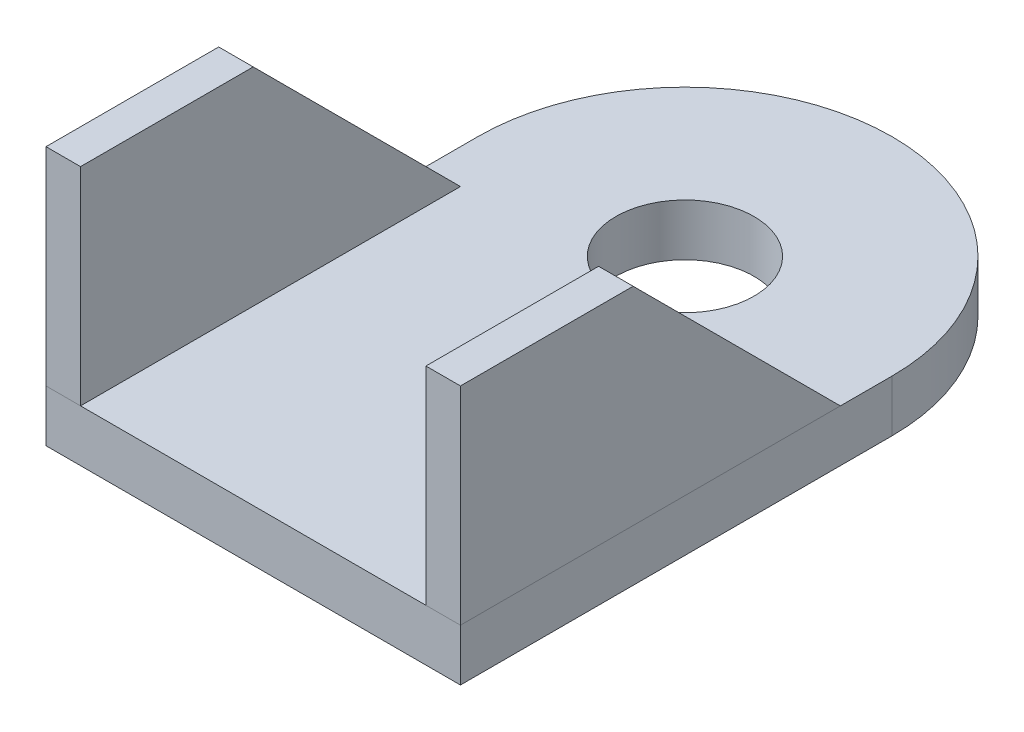
ISO-10303-21;
HEADER;
FILE_DESCRIPTION(('STEP AP214'),'2;1');
FILE_NAME('part.step','',(''),(''),'','','');
FILE_SCHEMA(('AUTOMOTIVE_DESIGN { 1 0 10303 214 1 1 1 1 }'));
ENDSEC;
DATA;
#1=APPLICATION_CONTEXT('core data for automotive mechanical design processes');
#2=APPLICATION_PROTOCOL_DEFINITION('international standard','automotive_design',2000,#1);
#3=PRODUCT_CONTEXT('',#1,'mechanical');
#4=PRODUCT('Part','Part','',(#3));
#5=PRODUCT_RELATED_PRODUCT_CATEGORY('part','',(#4));
#6=PRODUCT_DEFINITION_FORMATION('','',#4);
#7=PRODUCT_DEFINITION_CONTEXT('part definition',#1,'design');
#8=PRODUCT_DEFINITION('design','',#6,#7);
#9=PRODUCT_DEFINITION_SHAPE('','',#8);
#10=(LENGTH_UNIT() NAMED_UNIT(*) SI_UNIT(.MILLI.,.METRE.));
#11=(NAMED_UNIT(*) PLANE_ANGLE_UNIT() SI_UNIT($,.RADIAN.));
#12=(NAMED_UNIT(*) SI_UNIT($,.STERADIAN.) SOLID_ANGLE_UNIT());
#13=UNCERTAINTY_MEASURE_WITH_UNIT(LENGTH_MEASURE(1.E-05),#10,'distance_accuracy_value','');
#14=(GEOMETRIC_REPRESENTATION_CONTEXT(3) GLOBAL_UNCERTAINTY_ASSIGNED_CONTEXT((#13)) GLOBAL_UNIT_ASSIGNED_CONTEXT((#10,
#11,#12)) REPRESENTATION_CONTEXT('',''));
#15=CARTESIAN_POINT('',(0.,0.,0.));
#16=DIRECTION('',(0.,0.,1.));
#17=DIRECTION('',(1.,0.,0.));
#18=AXIS2_PLACEMENT_3D('',#15,#16,#17);
#19=CARTESIAN_POINT('',(-10.,3.,24.9999999999999));
#20=DIRECTION('',(0.,0.,-1.));
#21=DIRECTION('',(-1.,0.,0.));
#22=AXIS2_PLACEMENT_3D('',#19,#20,#21);
#23=PLANE('',#22);
#24=DIRECTION('',(0.,-1.,0.));
#25=VECTOR('',#24,1.);
#26=CARTESIAN_POINT('',(-12.,3.,24.9999999999999));
#27=LINE('',#26,#25);
#28=CARTESIAN_POINT('',(-12.,15.,24.9999999999999));
#29=VERTEX_POINT('',#28);
#30=CARTESIAN_POINT('',(-12.,3.,24.9999999999999));
#31=VERTEX_POINT('',#30);
#32=EDGE_CURVE('E123',#29,#31,#27,.T.);
#33=ORIENTED_EDGE('',*,*,#32,.T.);
#34=DIRECTION('',(-1.,0.,0.));
#35=VECTOR('',#34,1.);
#36=CARTESIAN_POINT('',(-10.,3.,24.9999999999999));
#37=LINE('',#36,#35);
#38=CARTESIAN_POINT('',(-10.,3.,24.9999999999999));
#39=VERTEX_POINT('',#38);
#40=EDGE_CURVE('E12',#39,#31,#37,.T.);
#41=ORIENTED_EDGE('',*,*,#40,.F.);
#42=DIRECTION('',(0.,-1.,0.));
#43=VECTOR('',#42,1.);
#44=CARTESIAN_POINT('',(-10.,3.,24.9999999999999));
#45=LINE('',#44,#43);
#46=CARTESIAN_POINT('',(-10.,15.,24.9999999999999));
#47=VERTEX_POINT('',#46);
#48=EDGE_CURVE('E111',#47,#39,#45,.T.);
#49=ORIENTED_EDGE('',*,*,#48,.F.);
#50=DIRECTION('',(-1.,0.,0.));
#51=VECTOR('',#50,1.);
#52=CARTESIAN_POINT('',(-10.,15.,24.9999999999999));
#53=LINE('',#52,#51);
#54=EDGE_CURVE('E119',#47,#29,#53,.T.);
#55=ORIENTED_EDGE('',*,*,#54,.T.);
#56=EDGE_LOOP('',(#33,#41,#49,#55));
#57=FACE_BOUND('',#56,.T.);
#58=ADVANCED_FACE('F60',(#57),#23,.F.);
#59=CARTESIAN_POINT('',(-10.,3.,0.));
#60=DIRECTION('',(0.,1.,0.));
#61=DIRECTION('',(0.,0.,1.));
#62=AXIS2_PLACEMENT_3D('',#59,#60,#61);
#63=PLANE('',#62);
#64=DIRECTION('',(0.,0.,-1.));
#65=VECTOR('',#64,1.);
#66=CARTESIAN_POINT('',(-12.,3.,0.));
#67=LINE('',#66,#65);
#68=CARTESIAN_POINT('',(-12.,3.,3.00000000000011));
#69=VERTEX_POINT('',#68);
#70=EDGE_CURVE('E115',#31,#69,#67,.T.);
#71=ORIENTED_EDGE('',*,*,#70,.T.);
#72=DIRECTION('',(-1.,0.,0.));
#73=VECTOR('',#72,1.);
#74=CARTESIAN_POINT('',(-10.,3.,3.00000000000011));
#75=LINE('',#74,#73);
#76=CARTESIAN_POINT('',(-10.,3.,3.00000000000011));
#77=VERTEX_POINT('',#76);
#78=EDGE_CURVE('E68',#77,#69,#75,.T.);
#79=ORIENTED_EDGE('',*,*,#78,.F.);
#80=DIRECTION('',(0.,0.,-1.));
#81=VECTOR('',#80,1.);
#82=CARTESIAN_POINT('',(-10.,3.,0.));
#83=LINE('',#82,#81);
#84=EDGE_CURVE('E106',#39,#77,#83,.T.);
#85=ORIENTED_EDGE('',*,*,#84,.F.);
#86=ORIENTED_EDGE('',*,*,#40,.T.);
#87=EDGE_LOOP('',(#71,#79,#85,#86));
#88=FACE_BOUND('',#87,.T.);
#89=ADVANCED_FACE('F114',(#88),#63,.F.);
#90=CARTESIAN_POINT('',(-10.,1.5,1.50000000000006));
#91=DIRECTION('',(0.,-0.707106781186547,0.707106781186548));
#92=DIRECTION('',(0.,-0.707106781186548,-0.707106781186547));
#93=AXIS2_PLACEMENT_3D('',#90,#91,#92);
#94=PLANE('',#93);
#95=DIRECTION('',(0.,0.707106781186548,0.707106781186547));
#96=VECTOR('',#95,1.);
#97=CARTESIAN_POINT('',(-12.,1.5,1.50000000000006));
#98=LINE('',#97,#96);
#99=CARTESIAN_POINT('',(-12.,15.,14.9999999999999));
#100=VERTEX_POINT('',#99);
#101=EDGE_CURVE('E93',#69,#100,#98,.T.);
#102=ORIENTED_EDGE('',*,*,#101,.T.);
#103=DIRECTION('',(-1.,0.,0.));
#104=VECTOR('',#103,1.);
#105=CARTESIAN_POINT('',(-10.,15.,14.9999999999999));
#106=LINE('',#105,#104);
#107=CARTESIAN_POINT('',(-10.,15.,14.9999999999999));
#108=VERTEX_POINT('',#107);
#109=EDGE_CURVE('E116',#108,#100,#106,.T.);
#110=ORIENTED_EDGE('',*,*,#109,.F.);
#111=DIRECTION('',(0.,0.707106781186548,0.707106781186547));
#112=VECTOR('',#111,1.);
#113=CARTESIAN_POINT('',(-10.,1.5,1.50000000000006));
#114=LINE('',#113,#112);
#115=EDGE_CURVE('E109',#77,#108,#114,.T.);
#116=ORIENTED_EDGE('',*,*,#115,.F.);
#117=ORIENTED_EDGE('',*,*,#78,.T.);
#118=EDGE_LOOP('',(#102,#110,#116,#117));
#119=FACE_BOUND('',#118,.T.);
#120=ADVANCED_FACE('F117',(#119),#94,.F.);
#121=CARTESIAN_POINT('',(-10.,15.,0.));
#122=DIRECTION('',(0.,-1.,0.));
#123=DIRECTION('',(0.,0.,-1.));
#124=AXIS2_PLACEMENT_3D('',#121,#122,#123);
#125=PLANE('',#124);
#126=DIRECTION('',(0.,0.,1.));
#127=VECTOR('',#126,1.);
#128=CARTESIAN_POINT('',(-12.,15.,0.));
#129=LINE('',#128,#127);
#130=EDGE_CURVE('E99',#100,#29,#129,.T.);
#131=ORIENTED_EDGE('',*,*,#130,.T.);
#132=ORIENTED_EDGE('',*,*,#54,.F.);
#133=DIRECTION('',(0.,0.,1.));
#134=VECTOR('',#133,1.);
#135=CARTESIAN_POINT('',(-10.,15.,0.));
#136=LINE('',#135,#134);
#137=EDGE_CURVE('E76',#108,#47,#136,.T.);
#138=ORIENTED_EDGE('',*,*,#137,.F.);
#139=ORIENTED_EDGE('',*,*,#109,.T.);
#140=EDGE_LOOP('',(#131,#132,#138,#139));
#141=FACE_BOUND('',#140,.T.);
#142=ADVANCED_FACE('F130',(#141),#125,.F.);
#143=CARTESIAN_POINT('',(-10.,0.,0.));
#144=DIRECTION('',(1.,0.,0.));
#145=DIRECTION('',(0.,0.,-1.));
#146=AXIS2_PLACEMENT_3D('',#143,#144,#145);
#147=PLANE('',#146);
#148=ORIENTED_EDGE('',*,*,#48,.T.);
#149=ORIENTED_EDGE('',*,*,#84,.T.);
#150=ORIENTED_EDGE('',*,*,#115,.T.);
#151=ORIENTED_EDGE('',*,*,#137,.T.);
#152=EDGE_LOOP('',(#148,#149,#150,#151));
#153=FACE_BOUND('',#152,.T.);
#154=ADVANCED_FACE('F107',(#153),#147,.T.);
#155=CARTESIAN_POINT('',(-12.,0.,0.));
#156=DIRECTION('',(1.,0.,0.));
#157=DIRECTION('',(0.,0.,-1.));
#158=AXIS2_PLACEMENT_3D('',#155,#156,#157);
#159=PLANE('',#158);
#160=ORIENTED_EDGE('',*,*,#32,.F.);
#161=ORIENTED_EDGE('',*,*,#130,.F.);
#162=ORIENTED_EDGE('',*,*,#101,.F.);
#163=ORIENTED_EDGE('',*,*,#70,.F.);
#164=EDGE_LOOP('',(#160,#161,#162,#163));
#165=FACE_BOUND('',#164,.T.);
#166=ADVANCED_FACE('F133',(#165),#159,.F.);
#167=CLOSED_SHELL('',(#58,#89,#120,#142,#154,#166));
#168=MANIFOLD_SOLID_BREP('B2',#167);
#169=CARTESIAN_POINT('',(10.,3.,3.00000000000011));
#170=DIRECTION('',(0.,-1.,0.));
#171=DIRECTION('',(0.,0.,-1.));
#172=AXIS2_PLACEMENT_3D('',#169,#170,#171);
#173=PLANE('',#172);
#174=DIRECTION('',(0.,0.,-1.));
#175=VECTOR('',#174,1.);
#176=CARTESIAN_POINT('',(12.,3.,3.00000000000011));
#177=LINE('',#176,#175);
#178=CARTESIAN_POINT('',(12.,3.,24.9999999999999));
#179=VERTEX_POINT('',#178);
#180=CARTESIAN_POINT('',(12.,3.,3.00000000000011));
#181=VERTEX_POINT('',#180);
#182=EDGE_CURVE('E247',#179,#181,#177,.T.);
#183=ORIENTED_EDGE('',*,*,#182,.F.);
#184=DIRECTION('',(1.,0.,0.));
#185=VECTOR('',#184,1.);
#186=CARTESIAN_POINT('',(10.,3.,24.9999999999999));
#187=LINE('',#186,#185);
#188=CARTESIAN_POINT('',(10.,3.,24.9999999999999));
#189=VERTEX_POINT('',#188);
#190=EDGE_CURVE('E58',#189,#179,#187,.T.);
#191=ORIENTED_EDGE('',*,*,#190,.F.);
#192=DIRECTION('',(0.,0.,-1.));
#193=VECTOR('',#192,1.);
#194=CARTESIAN_POINT('',(10.,3.,3.00000000000011));
#195=LINE('',#194,#193);
#196=CARTESIAN_POINT('',(10.,3.,3.00000000000011));
#197=VERTEX_POINT('',#196);
#198=EDGE_CURVE('E241',#189,#197,#195,.T.);
#199=ORIENTED_EDGE('',*,*,#198,.T.);
#200=DIRECTION('',(1.,0.,0.));
#201=VECTOR('',#200,1.);
#202=CARTESIAN_POINT('',(10.,3.,3.00000000000011));
#203=LINE('',#202,#201);
#204=EDGE_CURVE('E186',#197,#181,#203,.T.);
#205=ORIENTED_EDGE('',*,*,#204,.T.);
#206=EDGE_LOOP('',(#183,#191,#199,#205));
#207=FACE_BOUND('',#206,.T.);
#208=ADVANCED_FACE('F183',(#207),#173,.T.);
#209=CARTESIAN_POINT('',(10.,3.,24.9999999999999));
#210=DIRECTION('',(0.,0.,1.));
#211=DIRECTION('',(1.,0.,0.));
#212=AXIS2_PLACEMENT_3D('',#209,#210,#211);
#213=PLANE('',#212);
#214=DIRECTION('',(0.,-1.,0.));
#215=VECTOR('',#214,1.);
#216=CARTESIAN_POINT('',(12.,3.,24.9999999999999));
#217=LINE('',#216,#215);
#218=CARTESIAN_POINT('',(12.,15.,24.9999999999999));
#219=VERTEX_POINT('',#218);
#220=EDGE_CURVE('E243',#219,#179,#217,.T.);
#221=ORIENTED_EDGE('',*,*,#220,.F.);
#222=DIRECTION('',(1.,0.,0.));
#223=VECTOR('',#222,1.);
#224=CARTESIAN_POINT('',(10.,15.,24.9999999999999));
#225=LINE('',#224,#223);
#226=CARTESIAN_POINT('',(10.,15.,24.9999999999999));
#227=VERTEX_POINT('',#226);
#228=EDGE_CURVE('E192',#227,#219,#225,.T.);
#229=ORIENTED_EDGE('',*,*,#228,.F.);
#230=DIRECTION('',(0.,-1.,0.));
#231=VECTOR('',#230,1.);
#232=CARTESIAN_POINT('',(10.,3.,24.9999999999999));
#233=LINE('',#232,#231);
#234=EDGE_CURVE('E238',#227,#189,#233,.T.);
#235=ORIENTED_EDGE('',*,*,#234,.T.);
#236=ORIENTED_EDGE('',*,*,#190,.T.);
#237=EDGE_LOOP('',(#221,#229,#235,#236));
#238=FACE_BOUND('',#237,.T.);
#239=ADVANCED_FACE('F257',(#238),#213,.T.);
#240=CARTESIAN_POINT('',(10.,15.,24.9999999999999));
#241=DIRECTION('',(0.,1.,0.));
#242=DIRECTION('',(0.,0.,1.));
#243=AXIS2_PLACEMENT_3D('',#240,#241,#242);
#244=PLANE('',#243);
#245=DIRECTION('',(0.,0.,1.));
#246=VECTOR('',#245,1.);
#247=CARTESIAN_POINT('',(12.,15.,24.9999999999999));
#248=LINE('',#247,#246);
#249=CARTESIAN_POINT('',(12.,15.,14.9999999999999));
#250=VERTEX_POINT('',#249);
#251=EDGE_CURVE('E233',#250,#219,#248,.T.);
#252=ORIENTED_EDGE('',*,*,#251,.F.);
#253=DIRECTION('',(1.,0.,0.));
#254=VECTOR('',#253,1.);
#255=CARTESIAN_POINT('',(10.,15.,14.9999999999999));
#256=LINE('',#255,#254);
#257=CARTESIAN_POINT('',(10.,15.,14.9999999999999));
#258=VERTEX_POINT('',#257);
#259=EDGE_CURVE('E228',#258,#250,#256,.T.);
#260=ORIENTED_EDGE('',*,*,#259,.F.);
#261=DIRECTION('',(0.,0.,1.));
#262=VECTOR('',#261,1.);
#263=CARTESIAN_POINT('',(10.,15.,24.9999999999999));
#264=LINE('',#263,#262);
#265=EDGE_CURVE('E231',#258,#227,#264,.T.);
#266=ORIENTED_EDGE('',*,*,#265,.T.);
#267=ORIENTED_EDGE('',*,*,#228,.T.);
#268=EDGE_LOOP('',(#252,#260,#266,#267));
#269=FACE_BOUND('',#268,.T.);
#270=ADVANCED_FACE('F230',(#269),#244,.T.);
#271=CARTESIAN_POINT('',(10.,15.,14.9999999999999));
#272=DIRECTION('',(0.,0.707106781186547,-0.707106781186548));
#273=DIRECTION('',(0.,0.707106781186548,0.707106781186547));
#274=AXIS2_PLACEMENT_3D('',#271,#272,#273);
#275=PLANE('',#274);
#276=DIRECTION('',(0.,0.707106781186548,0.707106781186547));
#277=VECTOR('',#276,1.);
#278=CARTESIAN_POINT('',(12.,15.,14.9999999999999));
#279=LINE('',#278,#277);
#280=EDGE_CURVE('E250',#181,#250,#279,.T.);
#281=ORIENTED_EDGE('',*,*,#280,.F.);
#282=ORIENTED_EDGE('',*,*,#204,.F.);
#283=DIRECTION('',(0.,0.707106781186548,0.707106781186547));
#284=VECTOR('',#283,1.);
#285=CARTESIAN_POINT('',(10.,15.,14.9999999999999));
#286=LINE('',#285,#284);
#287=EDGE_CURVE('E237',#197,#258,#286,.T.);
#288=ORIENTED_EDGE('',*,*,#287,.T.);
#289=ORIENTED_EDGE('',*,*,#259,.T.);
#290=EDGE_LOOP('',(#281,#282,#288,#289));
#291=FACE_BOUND('',#290,.T.);
#292=ADVANCED_FACE('F240',(#291),#275,.T.);
#293=CARTESIAN_POINT('',(10.,0.,0.));
#294=DIRECTION('',(-1.,0.,0.));
#295=DIRECTION('',(0.,0.,1.));
#296=AXIS2_PLACEMENT_3D('',#293,#294,#295);
#297=PLANE('',#296);
#298=ORIENTED_EDGE('',*,*,#198,.F.);
#299=ORIENTED_EDGE('',*,*,#234,.F.);
#300=ORIENTED_EDGE('',*,*,#265,.F.);
#301=ORIENTED_EDGE('',*,*,#287,.F.);
#302=EDGE_LOOP('',(#298,#299,#300,#301));
#303=FACE_BOUND('',#302,.T.);
#304=ADVANCED_FACE('F236',(#303),#297,.T.);
#305=CARTESIAN_POINT('',(12.,0.,0.));
#306=DIRECTION('',(-1.,0.,0.));
#307=DIRECTION('',(0.,0.,1.));
#308=AXIS2_PLACEMENT_3D('',#305,#306,#307);
#309=PLANE('',#308);
#310=ORIENTED_EDGE('',*,*,#182,.T.);
#311=ORIENTED_EDGE('',*,*,#280,.T.);
#312=ORIENTED_EDGE('',*,*,#251,.T.);
#313=ORIENTED_EDGE('',*,*,#220,.T.);
#314=EDGE_LOOP('',(#310,#311,#312,#313));
#315=FACE_BOUND('',#314,.T.);
#316=ADVANCED_FACE('F256',(#315),#309,.F.);
#317=CLOSED_SHELL('',(#208,#239,#270,#292,#304,#316));
#318=MANIFOLD_SOLID_BREP('B6',#317);
#319=CARTESIAN_POINT('',(0.,0.,0.));
#320=DIRECTION('',(0.,1.,0.));
#321=DIRECTION('',(0.,0.,1.));
#322=AXIS2_PLACEMENT_3D('',#319,#320,#321);
#323=PLANE('',#322);
#324=CARTESIAN_POINT('',(0.,0.,0.));
#325=DIRECTION('',(0.,1.,0.));
#326=DIRECTION('',(0.,0.,1.));
#327=AXIS2_PLACEMENT_3D('',#324,#325,#326);
#328=CIRCLE('',#327,12.);
#329=CARTESIAN_POINT('',(12.,0.,0.));
#330=VERTEX_POINT('',#329);
#331=CARTESIAN_POINT('',(-12.,0.,0.));
#332=VERTEX_POINT('',#331);
#333=EDGE_CURVE('E181',#330,#332,#328,.F.);
#334=ORIENTED_EDGE('',*,*,#333,.F.);
#335=DIRECTION('',(0.,0.,-1.));
#336=VECTOR('',#335,1.);
#337=CARTESIAN_POINT('',(12.,0.,0.));
#338=LINE('',#337,#336);
#339=CARTESIAN_POINT('',(12.,0.,24.9999999999999));
#340=VERTEX_POINT('',#339);
#341=EDGE_CURVE('E375',#340,#330,#338,.T.);
#342=ORIENTED_EDGE('',*,*,#341,.F.);
#343=DIRECTION('',(1.,0.,0.));
#344=VECTOR('',#343,1.);
#345=CARTESIAN_POINT('',(0.,0.,24.9999999999999));
#346=LINE('',#345,#344);
#347=CARTESIAN_POINT('',(-12.,0.,24.9999999999999));
#348=VERTEX_POINT('',#347);
#349=EDGE_CURVE('E341',#348,#340,#346,.T.);
#350=ORIENTED_EDGE('',*,*,#349,.F.);
#351=DIRECTION('',(0.,0.,1.));
#352=VECTOR('',#351,1.);
#353=CARTESIAN_POINT('',(-12.,0.,0.));
#354=LINE('',#353,#352);
#355=EDGE_CURVE('E335',#332,#348,#354,.T.);
#356=ORIENTED_EDGE('',*,*,#355,.F.);
#357=EDGE_LOOP('',(#334,#342,#350,#356));
#358=FACE_BOUND('',#357,.T.);
#359=ADVANCED_FACE('F301',(#358),#323,.F.);
#360=CARTESIAN_POINT('',(0.,0.,0.));
#361=DIRECTION('',(0.,1.,0.));
#362=DIRECTION('',(0.,0.,1.));
#363=AXIS2_PLACEMENT_3D('',#360,#361,#362);
#364=CIRCLE('',#363,12.);
#365=EDGE_CURVE('E362',#330,#332,#364,.T.);
#366=ORIENTED_EDGE('',*,*,#365,.F.);
#367=ORIENTED_EDGE('',*,*,#333,.T.);
#368=EDGE_LOOP('',(#366,#367));
#369=FACE_BOUND('',#368,.T.);
#370=CARTESIAN_POINT('',(0.,0.,0.));
#371=DIRECTION('',(0.,1.,0.));
#372=DIRECTION('',(0.,0.,1.));
#373=AXIS2_PLACEMENT_3D('',#370,#371,#372);
#374=CIRCLE('',#373,9.);
#375=CARTESIAN_POINT('',(0.,0.,9.));
#376=VERTEX_POINT('',#375);
#377=EDGE_CURVE('E311',#376,#376,#374,.F.);
#378=ORIENTED_EDGE('',*,*,#377,.F.);
#379=EDGE_LOOP('',(#378));
#380=FACE_BOUND('',#379,.T.);
#381=ADVANCED_FACE('F395',(#369,#380),#323,.F.);
#382=CARTESIAN_POINT('',(12.,3.,0.));
#383=DIRECTION('',(-1.,0.,0.));
#384=DIRECTION('',(0.,0.,1.));
#385=AXIS2_PLACEMENT_3D('',#382,#383,#384);
#386=PLANE('',#385);
#387=ORIENTED_EDGE('',*,*,#341,.T.);
#388=DIRECTION('',(0.,-1.,0.));
#389=VECTOR('',#388,1.);
#390=CARTESIAN_POINT('',(12.,3.,0.));
#391=LINE('',#390,#389);
#392=CARTESIAN_POINT('',(12.,3.,0.));
#393=VERTEX_POINT('',#392);
#394=EDGE_CURVE('E363',#393,#330,#391,.T.);
#395=ORIENTED_EDGE('',*,*,#394,.F.);
#396=DIRECTION('',(0.,0.,-1.));
#397=VECTOR('',#396,1.);
#398=CARTESIAN_POINT('',(12.,3.,0.));
#399=LINE('',#398,#397);
#400=CARTESIAN_POINT('',(12.,3.,24.9999999999999));
#401=VERTEX_POINT('',#400);
#402=EDGE_CURVE('E355',#401,#393,#399,.T.);
#403=ORIENTED_EDGE('',*,*,#402,.F.);
#404=DIRECTION('',(0.,-1.,0.));
#405=VECTOR('',#404,1.);
#406=CARTESIAN_POINT('',(12.,3.,24.9999999999999));
#407=LINE('',#406,#405);
#408=EDGE_CURVE('E374',#401,#340,#407,.T.);
#409=ORIENTED_EDGE('',*,*,#408,.T.);
#410=EDGE_LOOP('',(#387,#395,#403,#409));
#411=FACE_BOUND('',#410,.T.);
#412=ADVANCED_FACE('F303',(#411),#386,.F.);
#413=CARTESIAN_POINT('',(0.,3.,0.));
#414=DIRECTION('',(0.,-1.,0.));
#415=DIRECTION('',(0.,0.,-1.));
#416=AXIS2_PLACEMENT_3D('',#413,#414,#415);
#417=CYLINDRICAL_SURFACE('',#416,12.);
#418=ORIENTED_EDGE('',*,*,#365,.T.);
#419=DIRECTION('',(0.,-1.,0.));
#420=VECTOR('',#419,1.);
#421=CARTESIAN_POINT('',(-12.,3.,0.));
#422=LINE('',#421,#420);
#423=CARTESIAN_POINT('',(-12.,3.,0.));
#424=VERTEX_POINT('',#423);
#425=EDGE_CURVE('E359',#424,#332,#422,.T.);
#426=ORIENTED_EDGE('',*,*,#425,.F.);
#427=CARTESIAN_POINT('',(0.,3.,0.));
#428=DIRECTION('',(0.,1.,0.));
#429=DIRECTION('',(0.,0.,1.));
#430=AXIS2_PLACEMENT_3D('',#427,#428,#429);
#431=CIRCLE('',#430,12.);
#432=EDGE_CURVE('E349',#393,#424,#431,.T.);
#433=ORIENTED_EDGE('',*,*,#432,.F.);
#434=ORIENTED_EDGE('',*,*,#394,.T.);
#435=EDGE_LOOP('',(#418,#426,#433,#434));
#436=FACE_BOUND('',#435,.T.);
#437=ADVANCED_FACE('F360',(#436),#417,.T.);
#438=CARTESIAN_POINT('',(-12.,3.,0.));
#439=DIRECTION('',(1.,0.,0.));
#440=DIRECTION('',(0.,0.,-1.));
#441=AXIS2_PLACEMENT_3D('',#438,#439,#440);
#442=PLANE('',#441);
#443=ORIENTED_EDGE('',*,*,#355,.T.);
#444=DIRECTION('',(0.,-1.,0.));
#445=VECTOR('',#444,1.);
#446=CARTESIAN_POINT('',(-12.,3.,24.9999999999999));
#447=LINE('',#446,#445);
#448=CARTESIAN_POINT('',(-12.,3.,24.9999999999999));
#449=VERTEX_POINT('',#448);
#450=EDGE_CURVE('E364',#449,#348,#447,.T.);
#451=ORIENTED_EDGE('',*,*,#450,.F.);
#452=DIRECTION('',(0.,0.,1.));
#453=VECTOR('',#452,1.);
#454=CARTESIAN_POINT('',(-12.,3.,0.));
#455=LINE('',#454,#453);
#456=EDGE_CURVE('E353',#424,#449,#455,.T.);
#457=ORIENTED_EDGE('',*,*,#456,.F.);
#458=ORIENTED_EDGE('',*,*,#425,.T.);
#459=EDGE_LOOP('',(#443,#451,#457,#458));
#460=FACE_BOUND('',#459,.T.);
#461=ADVANCED_FACE('F366',(#460),#442,.F.);
#462=CARTESIAN_POINT('',(0.,3.,24.9999999999999));
#463=DIRECTION('',(0.,0.,-1.));
#464=DIRECTION('',(-1.,0.,0.));
#465=AXIS2_PLACEMENT_3D('',#462,#463,#464);
#466=PLANE('',#465);
#467=ORIENTED_EDGE('',*,*,#349,.T.);
#468=ORIENTED_EDGE('',*,*,#408,.F.);
#469=DIRECTION('',(1.,0.,0.));
#470=VECTOR('',#469,1.);
#471=CARTESIAN_POINT('',(0.,3.,24.9999999999999));
#472=LINE('',#471,#470);
#473=EDGE_CURVE('E319',#449,#401,#472,.T.);
#474=ORIENTED_EDGE('',*,*,#473,.F.);
#475=ORIENTED_EDGE('',*,*,#450,.T.);
#476=EDGE_LOOP('',(#467,#468,#474,#475));
#477=FACE_BOUND('',#476,.T.);
#478=ADVANCED_FACE('F415',(#477),#466,.F.);
#479=CARTESIAN_POINT('',(0.,3.,0.));
#480=DIRECTION('',(0.,-1.,0.));
#481=DIRECTION('',(0.,0.,-1.));
#482=AXIS2_PLACEMENT_3D('',#479,#480,#481);
#483=CYLINDRICAL_SURFACE('',#482,4.);
#484=CARTESIAN_POINT('',(0.,3.,0.));
#485=DIRECTION('',(0.,1.,0.));
#486=DIRECTION('',(0.,0.,1.));
#487=AXIS2_PLACEMENT_3D('',#484,#485,#486);
#488=CIRCLE('',#487,4.);
#489=CARTESIAN_POINT('',(0.,3.,4.));
#490=VERTEX_POINT('',#489);
#491=EDGE_CURVE('E368',#490,#490,#488,.T.);
#492=ORIENTED_EDGE('',*,*,#491,.T.);
#493=EDGE_LOOP('',(#492));
#494=FACE_BOUND('',#493,.T.);
#495=CARTESIAN_POINT('',(0.,0.,0.));
#496=DIRECTION('',(0.,1.,0.));
#497=DIRECTION('',(0.,0.,1.));
#498=AXIS2_PLACEMENT_3D('',#495,#496,#497);
#499=CIRCLE('',#498,4.);
#500=CARTESIAN_POINT('',(0.,0.,4.));
#501=VERTEX_POINT('',#500);
#502=EDGE_CURVE('E381',#501,#501,#499,.T.);
#503=ORIENTED_EDGE('',*,*,#502,.F.);
#504=EDGE_LOOP('',(#503));
#505=FACE_BOUND('',#504,.T.);
#506=ADVANCED_FACE('F411',(#494,#505),#483,.F.);
#507=CARTESIAN_POINT('',(0.,3.,0.));
#508=DIRECTION('',(0.,1.,0.));
#509=DIRECTION('',(0.,0.,1.));
#510=AXIS2_PLACEMENT_3D('',#507,#508,#509);
#511=PLANE('',#510);
#512=ORIENTED_EDGE('',*,*,#402,.T.);
#513=ORIENTED_EDGE('',*,*,#432,.T.);
#514=ORIENTED_EDGE('',*,*,#456,.T.);
#515=ORIENTED_EDGE('',*,*,#473,.T.);
#516=EDGE_LOOP('',(#512,#513,#514,#515));
#517=FACE_BOUND('',#516,.T.);
#518=ORIENTED_EDGE('',*,*,#491,.F.);
#519=EDGE_LOOP('',(#518));
#520=FACE_BOUND('',#519,.T.);
#521=ADVANCED_FACE('F350',(#517,#520),#511,.T.);
#522=ORIENTED_EDGE('',*,*,#377,.T.);
#523=EDGE_LOOP('',(#522));
#524=FACE_BOUND('',#523,.T.);
#525=ORIENTED_EDGE('',*,*,#502,.T.);
#526=EDGE_LOOP('',(#525));
#527=FACE_BOUND('',#526,.T.);
#528=ADVANCED_FACE('F392',(#524,#527),#323,.F.);
#529=CLOSED_SHELL('',(#359,#381,#412,#437,#461,#478,#506,#521,#528));
#530=MANIFOLD_SOLID_BREP('B52',#529);
#531=ADVANCED_BREP_SHAPE_REPRESENTATION('',(#18,#168,#318,#530),#14);
#532=SHAPE_DEFINITION_REPRESENTATION(#9,#531);
ENDSEC;
END-ISO-10303-21;
